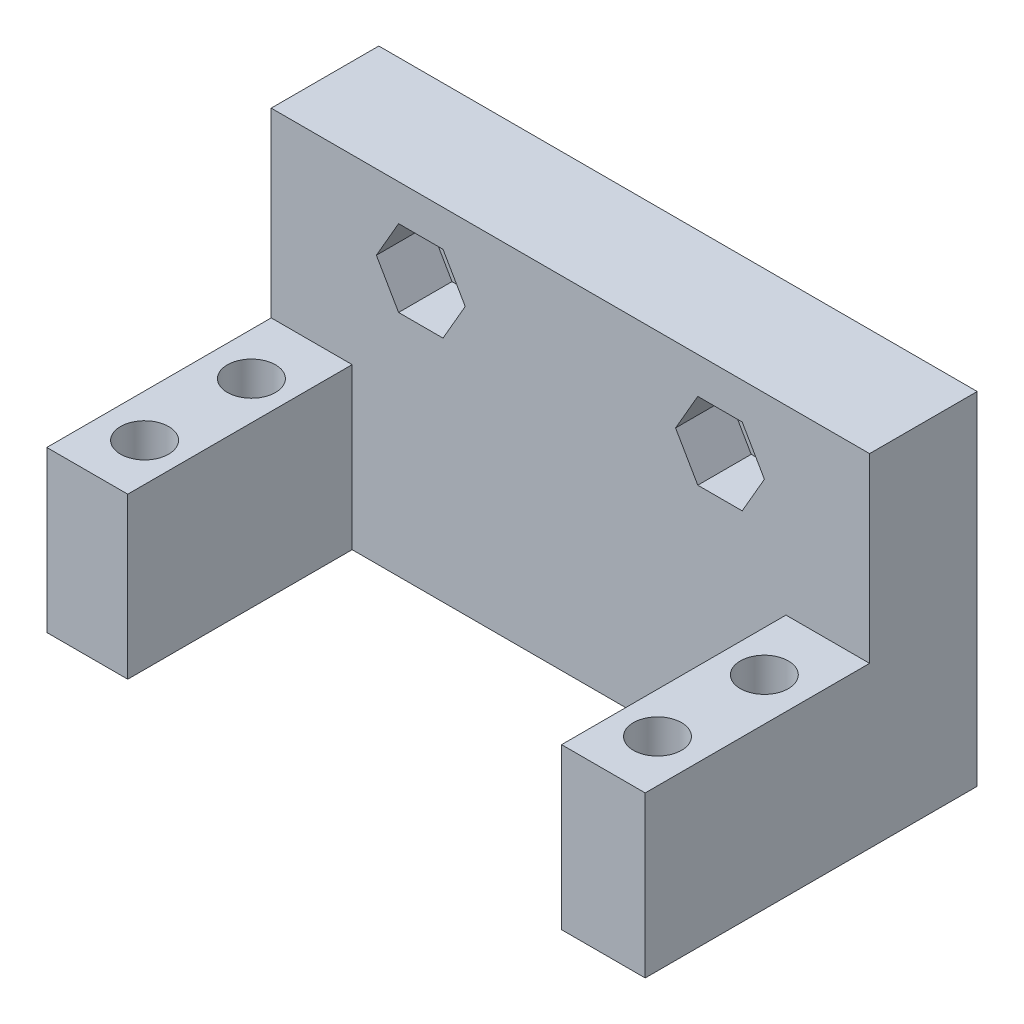
ISO-10303-21;
HEADER;
FILE_DESCRIPTION(('STEP AP214'),'2;1');
FILE_NAME('part.step','',(''),(''),'','','');
FILE_SCHEMA(('AUTOMOTIVE_DESIGN { 1 0 10303 214 1 1 1 1 }'));
ENDSEC;
DATA;
#1=APPLICATION_CONTEXT('core data for automotive mechanical design processes');
#2=APPLICATION_PROTOCOL_DEFINITION('international standard','automotive_design',2000,#1);
#3=PRODUCT_CONTEXT('',#1,'mechanical');
#4=PRODUCT('Part','Part','',(#3));
#5=PRODUCT_RELATED_PRODUCT_CATEGORY('part','',(#4));
#6=PRODUCT_DEFINITION_FORMATION('','',#4);
#7=PRODUCT_DEFINITION_CONTEXT('part definition',#1,'design');
#8=PRODUCT_DEFINITION('design','',#6,#7);
#9=PRODUCT_DEFINITION_SHAPE('','',#8);
#10=(LENGTH_UNIT() NAMED_UNIT(*) SI_UNIT(.MILLI.,.METRE.));
#11=(NAMED_UNIT(*) PLANE_ANGLE_UNIT() SI_UNIT($,.RADIAN.));
#12=(NAMED_UNIT(*) SI_UNIT($,.STERADIAN.) SOLID_ANGLE_UNIT());
#13=UNCERTAINTY_MEASURE_WITH_UNIT(LENGTH_MEASURE(1.E-05),#10,'distance_accuracy_value','');
#14=(GEOMETRIC_REPRESENTATION_CONTEXT(3) GLOBAL_UNCERTAINTY_ASSIGNED_CONTEXT((#13)) GLOBAL_UNIT_ASSIGNED_CONTEXT((#10,
#11,#12)) REPRESENTATION_CONTEXT('',''));
#15=CARTESIAN_POINT('',(0.,0.,0.));
#16=DIRECTION('',(0.,0.,1.));
#17=DIRECTION('',(1.,0.,0.));
#18=AXIS2_PLACEMENT_3D('',#15,#16,#17);
#19=CARTESIAN_POINT('',(0.,-14.,10.07));
#20=DIRECTION('',(0.,0.,1.));
#21=DIRECTION('',(1.,0.,0.));
#22=AXIS2_PLACEMENT_3D('',#19,#20,#21);
#23=PLANE('',#22);
#24=DIRECTION('',(-0.500000000000005,0.866025403784436,0.));
#25=VECTOR('',#24,1.);
#26=CARTESIAN_POINT('',(-7.38230854637598,-4.2621778264911,10.07));
#27=LINE('',#26,#25);
#28=CARTESIAN_POINT('',(-9.84307806183471,0.,10.07));
#29=VERTEX_POINT('',#28);
#30=CARTESIAN_POINT('',(-11.9215390309174,3.6,10.07));
#31=VERTEX_POINT('',#30);
#32=EDGE_CURVE('E284',#29,#31,#27,.T.);
#33=ORIENTED_EDGE('',*,*,#32,.F.);
#34=DIRECTION('',(0.499999999999996,0.866025403784441,0.));
#35=VECTOR('',#34,1.);
#36=CARTESIAN_POINT('',(-7.38230854637608,4.26217782649105,10.07));
#37=LINE('',#36,#35);
#38=CARTESIAN_POINT('',(-11.9215390309173,-3.59999999999998,10.07));
#39=VERTEX_POINT('',#38);
#40=EDGE_CURVE('E268',#39,#29,#37,.T.);
#41=ORIENTED_EDGE('',*,*,#40,.F.);
#42=DIRECTION('',(1.,0.,0.));
#43=VECTOR('',#42,1.);
#44=CARTESIAN_POINT('',(0.,-3.59999999999992,10.07));
#45=LINE('',#44,#43);
#46=CARTESIAN_POINT('',(-16.0784609690826,-3.60000000000001,10.07));
#47=VERTEX_POINT('',#46);
#48=EDGE_CURVE('E296',#47,#39,#45,.T.);
#49=ORIENTED_EDGE('',*,*,#48,.F.);
#50=DIRECTION('',(0.500000000000005,-0.866025403784436,0.));
#51=VECTOR('',#50,1.);
#52=CARTESIAN_POINT('',(-13.6176914536239,-7.86217782649112,10.07));
#53=LINE('',#52,#51);
#54=CARTESIAN_POINT('',(-18.1569219381653,0.,10.07));
#55=VERTEX_POINT('',#54);
#56=EDGE_CURVE('E293',#55,#47,#53,.T.);
#57=ORIENTED_EDGE('',*,*,#56,.F.);
#58=DIRECTION('',(-0.5,-0.866025403784439,0.));
#59=VECTOR('',#58,1.);
#60=CARTESIAN_POINT('',(-13.617691453624,7.86217782649107,10.07));
#61=LINE('',#60,#59);
#62=CARTESIAN_POINT('',(-16.0784609690827,3.6,10.07));
#63=VERTEX_POINT('',#62);
#64=EDGE_CURVE('E290',#63,#55,#61,.T.);
#65=ORIENTED_EDGE('',*,*,#64,.F.);
#66=DIRECTION('',(-1.,0.,0.));
#67=VECTOR('',#66,1.);
#68=CARTESIAN_POINT('',(0.,3.6,10.07));
#69=LINE('',#68,#67);
#70=EDGE_CURVE('E286',#31,#63,#69,.T.);
#71=ORIENTED_EDGE('',*,*,#70,.F.);
#72=EDGE_LOOP('',(#33,#41,#49,#57,#65,#71));
#73=FACE_BOUND('',#72,.T.);
#74=DIRECTION('',(-0.500000000000004,0.866025403784436,0.));
#75=VECTOR('',#74,1.);
#76=CARTESIAN_POINT('',(13.6176914536239,7.86217782649111,10.07));
#77=LINE('',#76,#75);
#78=CARTESIAN_POINT('',(18.1569219381653,0.,10.07));
#79=VERTEX_POINT('',#78);
#80=CARTESIAN_POINT('',(16.0784609690826,3.59999999999999,10.07));
#81=VERTEX_POINT('',#80);
#82=EDGE_CURVE('E263',#79,#81,#77,.T.);
#83=ORIENTED_EDGE('',*,*,#82,.F.);
#84=DIRECTION('',(0.499999999999995,0.866025403784441,0.));
#85=VECTOR('',#84,1.);
#86=CARTESIAN_POINT('',(13.617691453624,-7.862177826491,10.07));
#87=LINE('',#86,#85);
#88=CARTESIAN_POINT('',(16.0784609690827,-3.59999999999998,10.07));
#89=VERTEX_POINT('',#88);
#90=EDGE_CURVE('E318',#89,#79,#87,.T.);
#91=ORIENTED_EDGE('',*,*,#90,.F.);
#92=DIRECTION('',(1.,0.,0.));
#93=VECTOR('',#92,1.);
#94=CARTESIAN_POINT('',(0.,-3.60000000000005,10.07));
#95=LINE('',#94,#93);
#96=CARTESIAN_POINT('',(11.9215390309174,-3.6,10.07));
#97=VERTEX_POINT('',#96);
#98=EDGE_CURVE('E344',#97,#89,#95,.T.);
#99=ORIENTED_EDGE('',*,*,#98,.F.);
#100=DIRECTION('',(0.500000000000004,-0.866025403784436,0.));
#101=VECTOR('',#100,1.);
#102=CARTESIAN_POINT('',(7.38230854637599,4.2621778264911,10.07));
#103=LINE('',#102,#101);
#104=CARTESIAN_POINT('',(9.84307806183472,0.,10.07));
#105=VERTEX_POINT('',#104);
#106=EDGE_CURVE('E341',#105,#97,#103,.T.);
#107=ORIENTED_EDGE('',*,*,#106,.F.);
#108=DIRECTION('',(-0.499999999999996,-0.866025403784441,0.));
#109=VECTOR('',#108,1.);
#110=CARTESIAN_POINT('',(7.38230854637609,-4.26217782649106,10.07));
#111=LINE('',#110,#109);
#112=CARTESIAN_POINT('',(11.9215390309173,3.59999999999997,10.07));
#113=VERTEX_POINT('',#112);
#114=EDGE_CURVE('E338',#113,#105,#111,.T.);
#115=ORIENTED_EDGE('',*,*,#114,.F.);
#116=DIRECTION('',(-1.,0.,0.));
#117=VECTOR('',#116,1.);
#118=CARTESIAN_POINT('',(0.,3.59999999999993,10.07));
#119=LINE('',#118,#117);
#120=EDGE_CURVE('E335',#81,#113,#119,.T.);
#121=ORIENTED_EDGE('',*,*,#120,.F.);
#122=EDGE_LOOP('',(#83,#91,#99,#107,#115,#121));
#123=FACE_BOUND('',#122,.T.);
#124=DIRECTION('',(0.,-1.,0.));
#125=VECTOR('',#124,1.);
#126=CARTESIAN_POINT('',(20.1750886473847,-9.99999999999999,10.07));
#127=LINE('',#126,#125);
#128=CARTESIAN_POINT('',(20.1750886473847,-9.99999999999999,10.07));
#129=VERTEX_POINT('',#128);
#130=CARTESIAN_POINT('',(20.1750886473847,-25.,10.07));
#131=VERTEX_POINT('',#130);
#132=EDGE_CURVE('E214',#129,#131,#127,.T.);
#133=ORIENTED_EDGE('',*,*,#132,.F.);
#134=DIRECTION('',(-1.,0.,0.));
#135=VECTOR('',#134,1.);
#136=CARTESIAN_POINT('',(28.,-10.,10.07));
#137=LINE('',#136,#135);
#138=CARTESIAN_POINT('',(28.,-10.,10.07));
#139=VERTEX_POINT('',#138);
#140=EDGE_CURVE('E211',#139,#129,#137,.T.);
#141=ORIENTED_EDGE('',*,*,#140,.F.);
#142=DIRECTION('',(0.,1.,0.));
#143=VECTOR('',#142,1.);
#144=CARTESIAN_POINT('',(28.,-10.,10.07));
#145=LINE('',#144,#143);
#146=CARTESIAN_POINT('',(28.,7.,10.07));
#147=VERTEX_POINT('',#146);
#148=EDGE_CURVE('E238',#139,#147,#145,.T.);
#149=ORIENTED_EDGE('',*,*,#148,.T.);
#150=DIRECTION('',(1.,0.,0.));
#151=VECTOR('',#150,1.);
#152=CARTESIAN_POINT('',(0.,7.,10.07));
#153=LINE('',#152,#151);
#154=CARTESIAN_POINT('',(-28.,7.,10.07));
#155=VERTEX_POINT('',#154);
#156=EDGE_CURVE('E386',#155,#147,#153,.T.);
#157=ORIENTED_EDGE('',*,*,#156,.F.);
#158=DIRECTION('',(0.,1.,0.));
#159=VECTOR('',#158,1.);
#160=CARTESIAN_POINT('',(-28.,-10.,10.07));
#161=LINE('',#160,#159);
#162=CARTESIAN_POINT('',(-28.,-10.,10.07));
#163=VERTEX_POINT('',#162);
#164=EDGE_CURVE('E239',#163,#155,#161,.T.);
#165=ORIENTED_EDGE('',*,*,#164,.F.);
#166=CARTESIAN_POINT('',(-20.4249113526153,-10.,10.07));
#167=VERTEX_POINT('',#166);
#168=EDGE_CURVE('E58',#167,#163,#137,.T.);
#169=ORIENTED_EDGE('',*,*,#168,.F.);
#170=DIRECTION('',(0.,1.,0.));
#171=VECTOR('',#170,1.);
#172=CARTESIAN_POINT('',(-20.4249113526153,-25.,10.07));
#173=LINE('',#172,#171);
#174=CARTESIAN_POINT('',(-20.4249113526153,-25.,10.07));
#175=VERTEX_POINT('',#174);
#176=EDGE_CURVE('E229',#175,#167,#173,.T.);
#177=ORIENTED_EDGE('',*,*,#176,.F.);
#178=DIRECTION('',(-1.,0.,0.));
#179=VECTOR('',#178,1.);
#180=CARTESIAN_POINT('',(0.,-25.,10.07));
#181=LINE('',#180,#179);
#182=EDGE_CURVE('E66',#131,#175,#181,.T.);
#183=ORIENTED_EDGE('',*,*,#182,.F.);
#184=EDGE_LOOP('',(#133,#141,#149,#157,#165,#169,#177,#183));
#185=FACE_BOUND('',#184,.T.);
#186=ADVANCED_FACE('F41',(#73,#123,#185),#23,.T.);
#187=CARTESIAN_POINT('',(0.,0.,31.07));
#188=DIRECTION('',(0.,0.,1.));
#189=DIRECTION('',(1.,0.,0.));
#190=AXIS2_PLACEMENT_3D('',#187,#188,#189);
#191=PLANE('',#190);
#192=DIRECTION('',(-1.,0.,0.));
#193=VECTOR('',#192,1.);
#194=CARTESIAN_POINT('',(0.,-25.,31.07));
#195=LINE('',#194,#193);
#196=CARTESIAN_POINT('',(-20.4249113526153,-25.,31.07));
#197=VERTEX_POINT('',#196);
#198=CARTESIAN_POINT('',(-28.,-25.,31.07));
#199=VERTEX_POINT('',#198);
#200=EDGE_CURVE('E366',#197,#199,#195,.T.);
#201=ORIENTED_EDGE('',*,*,#200,.F.);
#202=DIRECTION('',(0.,-1.,0.));
#203=VECTOR('',#202,1.);
#204=CARTESIAN_POINT('',(-20.4249113526153,-25.,31.07));
#205=LINE('',#204,#203);
#206=CARTESIAN_POINT('',(-20.4249113526153,-10.,31.07));
#207=VERTEX_POINT('',#206);
#208=EDGE_CURVE('E223',#207,#197,#205,.T.);
#209=ORIENTED_EDGE('',*,*,#208,.F.);
#210=DIRECTION('',(1.,0.,0.));
#211=VECTOR('',#210,1.);
#212=CARTESIAN_POINT('',(28.,-10.,31.07));
#213=LINE('',#212,#211);
#214=CARTESIAN_POINT('',(-28.,-10.,31.07));
#215=VERTEX_POINT('',#214);
#216=EDGE_CURVE('E204',#215,#207,#213,.T.);
#217=ORIENTED_EDGE('',*,*,#216,.F.);
#218=DIRECTION('',(0.,-1.,0.));
#219=VECTOR('',#218,1.);
#220=CARTESIAN_POINT('',(-28.,-7.,31.07));
#221=LINE('',#220,#219);
#222=EDGE_CURVE('E392',#215,#199,#221,.T.);
#223=ORIENTED_EDGE('',*,*,#222,.T.);
#224=EDGE_LOOP('',(#201,#209,#217,#223));
#225=FACE_BOUND('',#224,.T.);
#226=ADVANCED_FACE('F436',(#225),#191,.T.);
#227=DIRECTION('',(0.,1.,0.));
#228=VECTOR('',#227,1.);
#229=CARTESIAN_POINT('',(28.,-7.,31.07));
#230=LINE('',#229,#228);
#231=CARTESIAN_POINT('',(28.,-25.,31.07));
#232=VERTEX_POINT('',#231);
#233=CARTESIAN_POINT('',(28.,-10.,31.07));
#234=VERTEX_POINT('',#233);
#235=EDGE_CURVE('E200',#232,#234,#230,.T.);
#236=ORIENTED_EDGE('',*,*,#235,.T.);
#237=CARTESIAN_POINT('',(20.1750886473847,-9.99999999999999,31.07));
#238=VERTEX_POINT('',#237);
#239=EDGE_CURVE('E194',#238,#234,#213,.T.);
#240=ORIENTED_EDGE('',*,*,#239,.F.);
#241=DIRECTION('',(0.,1.,0.));
#242=VECTOR('',#241,1.);
#243=CARTESIAN_POINT('',(20.1750886473847,-9.99999999999999,31.07));
#244=LINE('',#243,#242);
#245=CARTESIAN_POINT('',(20.1750886473847,-25.,31.07));
#246=VERTEX_POINT('',#245);
#247=EDGE_CURVE('E199',#246,#238,#244,.T.);
#248=ORIENTED_EDGE('',*,*,#247,.F.);
#249=DIRECTION('',(-1.,0.,0.));
#250=VECTOR('',#249,1.);
#251=CARTESIAN_POINT('',(0.,-25.,31.07));
#252=LINE('',#251,#250);
#253=EDGE_CURVE('E378',#232,#246,#252,.T.);
#254=ORIENTED_EDGE('',*,*,#253,.F.);
#255=EDGE_LOOP('',(#236,#240,#248,#254));
#256=FACE_BOUND('',#255,.T.);
#257=ADVANCED_FACE('F196',(#256),#191,.T.);
#258=CARTESIAN_POINT('',(24.0000000000001,-13.3639610306789,25.92));
#259=DIRECTION('',(0.,1.,0.));
#260=DIRECTION('',(-1.,0.,0.));
#261=AXIS2_PLACEMENT_3D('',#258,#259,#260);
#262=CYLINDRICAL_SURFACE('',#261,2.25);
#263=CARTESIAN_POINT('',(24.0000000000001,-25.,25.92));
#264=DIRECTION('',(0.,-1.,0.));
#265=DIRECTION('',(1.,0.,0.));
#266=AXIS2_PLACEMENT_3D('',#263,#264,#265);
#267=CIRCLE('',#266,2.25);
#268=CARTESIAN_POINT('',(26.2500000000001,-25.,25.92));
#269=VERTEX_POINT('',#268);
#270=EDGE_CURVE('E362',#269,#269,#267,.F.);
#271=ORIENTED_EDGE('',*,*,#270,.F.);
#272=EDGE_LOOP('',(#271));
#273=FACE_BOUND('',#272,.T.);
#274=CARTESIAN_POINT('',(24.0000000000001,-10.,25.92));
#275=DIRECTION('',(0.,1.,0.));
#276=DIRECTION('',(-1.,0.,0.));
#277=AXIS2_PLACEMENT_3D('',#274,#275,#276);
#278=CIRCLE('',#277,2.25);
#279=CARTESIAN_POINT('',(21.7500000000001,-10.,25.92));
#280=VERTEX_POINT('',#279);
#281=EDGE_CURVE('E253',#280,#280,#278,.F.);
#282=ORIENTED_EDGE('',*,*,#281,.F.);
#283=EDGE_LOOP('',(#282));
#284=FACE_BOUND('',#283,.T.);
#285=ADVANCED_FACE('F530',(#273,#284),#262,.F.);
#286=CARTESIAN_POINT('',(-24.,-13.3639610306789,15.92));
#287=DIRECTION('',(0.,1.,0.));
#288=DIRECTION('',(-1.,0.,0.));
#289=AXIS2_PLACEMENT_3D('',#286,#287,#288);
#290=CYLINDRICAL_SURFACE('',#289,2.25);
#291=CARTESIAN_POINT('',(-24.,-25.,15.92));
#292=DIRECTION('',(0.,-1.,0.));
#293=DIRECTION('',(1.,0.,0.));
#294=AXIS2_PLACEMENT_3D('',#291,#292,#293);
#295=CIRCLE('',#294,2.25);
#296=CARTESIAN_POINT('',(-21.75,-25.,15.92));
#297=VERTEX_POINT('',#296);
#298=EDGE_CURVE('E380',#297,#297,#295,.F.);
#299=ORIENTED_EDGE('',*,*,#298,.F.);
#300=EDGE_LOOP('',(#299));
#301=FACE_BOUND('',#300,.T.);
#302=CARTESIAN_POINT('',(-24.,-10.,15.92));
#303=DIRECTION('',(0.,1.,0.));
#304=DIRECTION('',(-1.,0.,0.));
#305=AXIS2_PLACEMENT_3D('',#302,#303,#304);
#306=CIRCLE('',#305,2.25);
#307=CARTESIAN_POINT('',(-26.25,-10.,15.92));
#308=VERTEX_POINT('',#307);
#309=EDGE_CURVE('E250',#308,#308,#306,.F.);
#310=ORIENTED_EDGE('',*,*,#309,.F.);
#311=EDGE_LOOP('',(#310));
#312=FACE_BOUND('',#311,.T.);
#313=ADVANCED_FACE('F526',(#301,#312),#290,.F.);
#314=CARTESIAN_POINT('',(-23.9999999999999,-13.3639610306789,25.92));
#315=DIRECTION('',(0.,1.,0.));
#316=DIRECTION('',(-1.,0.,0.));
#317=AXIS2_PLACEMENT_3D('',#314,#315,#316);
#318=CYLINDRICAL_SURFACE('',#317,2.25);
#319=CARTESIAN_POINT('',(-23.9999999999999,-25.,25.92));
#320=DIRECTION('',(0.,-1.,0.));
#321=DIRECTION('',(1.,0.,0.));
#322=AXIS2_PLACEMENT_3D('',#319,#320,#321);
#323=CIRCLE('',#322,2.25);
#324=CARTESIAN_POINT('',(-21.7499999999999,-25.,25.92));
#325=VERTEX_POINT('',#324);
#326=EDGE_CURVE('E303',#325,#325,#323,.F.);
#327=ORIENTED_EDGE('',*,*,#326,.F.);
#328=EDGE_LOOP('',(#327));
#329=FACE_BOUND('',#328,.T.);
#330=CARTESIAN_POINT('',(-23.9999999999999,-10.,25.92));
#331=DIRECTION('',(0.,1.,0.));
#332=DIRECTION('',(-1.,0.,0.));
#333=AXIS2_PLACEMENT_3D('',#330,#331,#332);
#334=CIRCLE('',#333,2.25);
#335=CARTESIAN_POINT('',(-26.2499999999999,-10.,25.92));
#336=VERTEX_POINT('',#335);
#337=EDGE_CURVE('E247',#336,#336,#334,.F.);
#338=ORIENTED_EDGE('',*,*,#337,.F.);
#339=EDGE_LOOP('',(#338));
#340=FACE_BOUND('',#339,.T.);
#341=ADVANCED_FACE('F529',(#329,#340),#318,.F.);
#342=CARTESIAN_POINT('',(24.,-13.3639610306789,15.92));
#343=DIRECTION('',(0.,1.,0.));
#344=DIRECTION('',(-1.,0.,0.));
#345=AXIS2_PLACEMENT_3D('',#342,#343,#344);
#346=CYLINDRICAL_SURFACE('',#345,2.25);
#347=CARTESIAN_POINT('',(24.,-25.,15.92));
#348=DIRECTION('',(0.,-1.,0.));
#349=DIRECTION('',(1.,0.,0.));
#350=AXIS2_PLACEMENT_3D('',#347,#348,#349);
#351=CIRCLE('',#350,2.25);
#352=CARTESIAN_POINT('',(26.25,-25.,15.92));
#353=VERTEX_POINT('',#352);
#354=EDGE_CURVE('E383',#353,#353,#351,.F.);
#355=ORIENTED_EDGE('',*,*,#354,.F.);
#356=EDGE_LOOP('',(#355));
#357=FACE_BOUND('',#356,.T.);
#358=CARTESIAN_POINT('',(24.,-10.,15.92));
#359=DIRECTION('',(0.,1.,0.));
#360=DIRECTION('',(-1.,0.,0.));
#361=AXIS2_PLACEMENT_3D('',#358,#359,#360);
#362=CIRCLE('',#361,2.25);
#363=CARTESIAN_POINT('',(21.75,-10.,15.92));
#364=VERTEX_POINT('',#363);
#365=EDGE_CURVE('E242',#364,#364,#362,.F.);
#366=ORIENTED_EDGE('',*,*,#365,.F.);
#367=EDGE_LOOP('',(#366));
#368=FACE_BOUND('',#367,.T.);
#369=ADVANCED_FACE('F532',(#357,#368),#346,.F.);
#370=CARTESIAN_POINT('',(0.,7.,10.77));
#371=DIRECTION('',(0.,-1.,0.));
#372=DIRECTION('',(1.,0.,0.));
#373=AXIS2_PLACEMENT_3D('',#370,#371,#372);
#374=PLANE('',#373);
#375=DIRECTION('',(0.,0.,-1.));
#376=VECTOR('',#375,1.);
#377=CARTESIAN_POINT('',(-28.,7.,31.07));
#378=LINE('',#377,#376);
#379=CARTESIAN_POINT('',(-28.,7.,0.));
#380=VERTEX_POINT('',#379);
#381=EDGE_CURVE('E397',#155,#380,#378,.T.);
#382=ORIENTED_EDGE('',*,*,#381,.F.);
#383=ORIENTED_EDGE('',*,*,#156,.T.);
#384=DIRECTION('',(0.,0.,-1.));
#385=VECTOR('',#384,1.);
#386=CARTESIAN_POINT('',(28.,7.,31.07));
#387=LINE('',#386,#385);
#388=CARTESIAN_POINT('',(28.,7.,0.));
#389=VERTEX_POINT('',#388);
#390=EDGE_CURVE('E50',#147,#389,#387,.T.);
#391=ORIENTED_EDGE('',*,*,#390,.T.);
#392=DIRECTION('',(-1.,0.,0.));
#393=VECTOR('',#392,1.);
#394=CARTESIAN_POINT('',(0.,7.,0.));
#395=LINE('',#394,#393);
#396=EDGE_CURVE('E11',#389,#380,#395,.T.);
#397=ORIENTED_EDGE('',*,*,#396,.T.);
#398=EDGE_LOOP('',(#382,#383,#391,#397));
#399=FACE_BOUND('',#398,.T.);
#400=ADVANCED_FACE('F43',(#399),#374,.F.);
#401=CARTESIAN_POINT('',(0.,0.,0.));
#402=DIRECTION('',(0.,0.,1.));
#403=DIRECTION('',(1.,0.,0.));
#404=AXIS2_PLACEMENT_3D('',#401,#402,#403);
#405=PLANE('',#404);
#406=CARTESIAN_POINT('',(14.,0.,0.));
#407=DIRECTION('',(0.,0.,1.));
#408=DIRECTION('',(1.,0.,0.));
#409=AXIS2_PLACEMENT_3D('',#406,#407,#408);
#410=CIRCLE('',#409,2.2);
#411=CARTESIAN_POINT('',(16.2,0.,0.));
#412=VERTEX_POINT('',#411);
#413=EDGE_CURVE('E260',#412,#412,#410,.T.);
#414=ORIENTED_EDGE('',*,*,#413,.T.);
#415=EDGE_LOOP('',(#414));
#416=FACE_BOUND('',#415,.T.);
#417=CARTESIAN_POINT('',(-14.,0.,0.));
#418=DIRECTION('',(0.,0.,1.));
#419=DIRECTION('',(1.,0.,0.));
#420=AXIS2_PLACEMENT_3D('',#417,#418,#419);
#421=CIRCLE('',#420,2.2);
#422=CARTESIAN_POINT('',(-11.8,0.,0.));
#423=VERTEX_POINT('',#422);
#424=EDGE_CURVE('E257',#423,#423,#421,.T.);
#425=ORIENTED_EDGE('',*,*,#424,.T.);
#426=EDGE_LOOP('',(#425));
#427=FACE_BOUND('',#426,.T.);
#428=DIRECTION('',(0.,1.,0.));
#429=VECTOR('',#428,1.);
#430=CARTESIAN_POINT('',(28.,-64.0262474655312,0.));
#431=LINE('',#430,#429);
#432=CARTESIAN_POINT('',(28.,-25.,0.));
#433=VERTEX_POINT('',#432);
#434=EDGE_CURVE('E388',#433,#389,#431,.T.);
#435=ORIENTED_EDGE('',*,*,#434,.F.);
#436=DIRECTION('',(1.,0.,0.));
#437=VECTOR('',#436,1.);
#438=CARTESIAN_POINT('',(0.,-25.,0.));
#439=LINE('',#438,#437);
#440=CARTESIAN_POINT('',(-28.,-25.,0.));
#441=VERTEX_POINT('',#440);
#442=EDGE_CURVE('E372',#441,#433,#439,.T.);
#443=ORIENTED_EDGE('',*,*,#442,.F.);
#444=DIRECTION('',(0.,1.,0.));
#445=VECTOR('',#444,1.);
#446=CARTESIAN_POINT('',(-28.,-64.0262474655312,0.));
#447=LINE('',#446,#445);
#448=EDGE_CURVE('E389',#441,#380,#447,.T.);
#449=ORIENTED_EDGE('',*,*,#448,.T.);
#450=ORIENTED_EDGE('',*,*,#396,.F.);
#451=EDGE_LOOP('',(#435,#443,#449,#450));
#452=FACE_BOUND('',#451,.T.);
#453=ADVANCED_FACE('F457',(#416,#427,#452),#405,.F.);
#454=CARTESIAN_POINT('',(28.,-7.,31.07));
#455=DIRECTION('',(-1.,0.,0.));
#456=DIRECTION('',(0.,0.,1.));
#457=AXIS2_PLACEMENT_3D('',#454,#455,#456);
#458=PLANE('',#457);
#459=ORIENTED_EDGE('',*,*,#390,.F.);
#460=ORIENTED_EDGE('',*,*,#148,.F.);
#461=DIRECTION('',(0.,0.,-1.));
#462=VECTOR('',#461,1.);
#463=CARTESIAN_POINT('',(28.,-10.,31.07));
#464=LINE('',#463,#462);
#465=EDGE_CURVE('E234',#234,#139,#464,.T.);
#466=ORIENTED_EDGE('',*,*,#465,.F.);
#467=ORIENTED_EDGE('',*,*,#235,.F.);
#468=DIRECTION('',(0.,0.,1.));
#469=VECTOR('',#468,1.);
#470=CARTESIAN_POINT('',(28.,-25.,0.));
#471=LINE('',#470,#469);
#472=EDGE_CURVE('E375',#433,#232,#471,.T.);
#473=ORIENTED_EDGE('',*,*,#472,.F.);
#474=ORIENTED_EDGE('',*,*,#434,.T.);
#475=EDGE_LOOP('',(#459,#460,#466,#467,#473,#474));
#476=FACE_BOUND('',#475,.T.);
#477=ADVANCED_FACE('F447',(#476),#458,.F.);
#478=CARTESIAN_POINT('',(-28.,-7.,31.07));
#479=DIRECTION('',(1.,0.,0.));
#480=DIRECTION('',(0.,0.,-1.));
#481=AXIS2_PLACEMENT_3D('',#478,#479,#480);
#482=PLANE('',#481);
#483=DIRECTION('',(0.,0.,1.));
#484=VECTOR('',#483,1.);
#485=CARTESIAN_POINT('',(-28.,-10.,31.07));
#486=LINE('',#485,#484);
#487=EDGE_CURVE('E205',#163,#215,#486,.T.);
#488=ORIENTED_EDGE('',*,*,#487,.F.);
#489=ORIENTED_EDGE('',*,*,#164,.T.);
#490=ORIENTED_EDGE('',*,*,#381,.T.);
#491=ORIENTED_EDGE('',*,*,#448,.F.);
#492=DIRECTION('',(0.,0.,-1.));
#493=VECTOR('',#492,1.);
#494=CARTESIAN_POINT('',(-28.,-25.,0.));
#495=LINE('',#494,#493);
#496=EDGE_CURVE('E369',#199,#441,#495,.T.);
#497=ORIENTED_EDGE('',*,*,#496,.F.);
#498=ORIENTED_EDGE('',*,*,#222,.F.);
#499=EDGE_LOOP('',(#488,#489,#490,#491,#497,#498));
#500=FACE_BOUND('',#499,.T.);
#501=ADVANCED_FACE('F453',(#500),#482,.F.);
#502=CARTESIAN_POINT('',(0.,-25.,0.));
#503=DIRECTION('',(0.,-1.,0.));
#504=DIRECTION('',(1.,0.,0.));
#505=AXIS2_PLACEMENT_3D('',#502,#503,#504);
#506=PLANE('',#505);
#507=DIRECTION('',(0.,0.,1.));
#508=VECTOR('',#507,1.);
#509=CARTESIAN_POINT('',(20.1750886473847,-25.,31.07));
#510=LINE('',#509,#508);
#511=EDGE_CURVE('E218',#131,#246,#510,.T.);
#512=ORIENTED_EDGE('',*,*,#511,.F.);
#513=ORIENTED_EDGE('',*,*,#182,.T.);
#514=DIRECTION('',(0.,0.,-1.));
#515=VECTOR('',#514,1.);
#516=CARTESIAN_POINT('',(-20.4249113526153,-25.,31.07));
#517=LINE('',#516,#515);
#518=EDGE_CURVE('E226',#197,#175,#517,.T.);
#519=ORIENTED_EDGE('',*,*,#518,.F.);
#520=ORIENTED_EDGE('',*,*,#200,.T.);
#521=ORIENTED_EDGE('',*,*,#496,.T.);
#522=ORIENTED_EDGE('',*,*,#442,.T.);
#523=ORIENTED_EDGE('',*,*,#472,.T.);
#524=ORIENTED_EDGE('',*,*,#253,.T.);
#525=EDGE_LOOP('',(#512,#513,#519,#520,#521,#522,#523,#524));
#526=FACE_BOUND('',#525,.T.);
#527=ORIENTED_EDGE('',*,*,#326,.T.);
#528=EDGE_LOOP('',(#527));
#529=FACE_BOUND('',#528,.T.);
#530=ORIENTED_EDGE('',*,*,#270,.T.);
#531=EDGE_LOOP('',(#530));
#532=FACE_BOUND('',#531,.T.);
#533=ORIENTED_EDGE('',*,*,#298,.T.);
#534=EDGE_LOOP('',(#533));
#535=FACE_BOUND('',#534,.T.);
#536=ORIENTED_EDGE('',*,*,#354,.T.);
#537=EDGE_LOOP('',(#536));
#538=FACE_BOUND('',#537,.T.);
#539=ADVANCED_FACE('F441',(#526,#529,#532,#535,#538),#506,.T.);
#540=CARTESIAN_POINT('',(13.6176914536239,7.86217782649111,5.07));
#541=DIRECTION('',(0.866025403784436,0.500000000000004,0.));
#542=DIRECTION('',(-0.500000000000004,0.866025403784436,0.));
#543=AXIS2_PLACEMENT_3D('',#540,#541,#542);
#544=PLANE('',#543);
#545=ORIENTED_EDGE('',*,*,#82,.T.);
#546=DIRECTION('',(0.,0.,1.));
#547=VECTOR('',#546,1.);
#548=CARTESIAN_POINT('',(16.0784609690826,3.59999999999999,5.07));
#549=LINE('',#548,#547);
#550=CARTESIAN_POINT('',(16.0784609690826,3.59999999999999,5.07));
#551=VERTEX_POINT('',#550);
#552=EDGE_CURVE('E333',#551,#81,#549,.T.);
#553=ORIENTED_EDGE('',*,*,#552,.F.);
#554=DIRECTION('',(-0.500000000000004,0.866025403784436,0.));
#555=VECTOR('',#554,1.);
#556=CARTESIAN_POINT('',(13.6176914536239,7.86217782649111,5.07));
#557=LINE('',#556,#555);
#558=CARTESIAN_POINT('',(18.1569219381653,0.,5.07));
#559=VERTEX_POINT('',#558);
#560=EDGE_CURVE('E314',#559,#551,#557,.T.);
#561=ORIENTED_EDGE('',*,*,#560,.F.);
#562=DIRECTION('',(0.,0.,1.));
#563=VECTOR('',#562,1.);
#564=CARTESIAN_POINT('',(18.1569219381653,0.,5.07));
#565=LINE('',#564,#563);
#566=EDGE_CURVE('E287',#559,#79,#565,.T.);
#567=ORIENTED_EDGE('',*,*,#566,.T.);
#568=EDGE_LOOP('',(#545,#553,#561,#567));
#569=FACE_BOUND('',#568,.T.);
#570=ADVANCED_FACE('F505',(#569),#544,.F.);
#571=CARTESIAN_POINT('',(13.617691453624,-7.862177826491,5.07));
#572=DIRECTION('',(0.866025403784441,-0.499999999999995,0.));
#573=DIRECTION('',(0.499999999999995,0.866025403784441,0.));
#574=AXIS2_PLACEMENT_3D('',#571,#572,#573);
#575=PLANE('',#574);
#576=ORIENTED_EDGE('',*,*,#90,.T.);
#577=ORIENTED_EDGE('',*,*,#566,.F.);
#578=DIRECTION('',(0.499999999999995,0.866025403784441,0.));
#579=VECTOR('',#578,1.);
#580=CARTESIAN_POINT('',(13.617691453624,-7.862177826491,5.07));
#581=LINE('',#580,#579);
#582=CARTESIAN_POINT('',(16.0784609690827,-3.59999999999998,5.07));
#583=VERTEX_POINT('',#582);
#584=EDGE_CURVE('E330',#583,#559,#581,.T.);
#585=ORIENTED_EDGE('',*,*,#584,.F.);
#586=DIRECTION('',(0.,0.,1.));
#587=VECTOR('',#586,1.);
#588=CARTESIAN_POINT('',(16.0784609690827,-3.59999999999998,5.07));
#589=LINE('',#588,#587);
#590=EDGE_CURVE('E350',#583,#89,#589,.T.);
#591=ORIENTED_EDGE('',*,*,#590,.T.);
#592=EDGE_LOOP('',(#576,#577,#585,#591));
#593=FACE_BOUND('',#592,.T.);
#594=ADVANCED_FACE('F501',(#593),#575,.F.);
#595=CARTESIAN_POINT('',(0.,-3.60000000000005,5.07));
#596=DIRECTION('',(0.,-1.,0.));
#597=DIRECTION('',(1.,0.,0.));
#598=AXIS2_PLACEMENT_3D('',#595,#596,#597);
#599=PLANE('',#598);
#600=ORIENTED_EDGE('',*,*,#98,.T.);
#601=ORIENTED_EDGE('',*,*,#590,.F.);
#602=DIRECTION('',(1.,0.,0.));
#603=VECTOR('',#602,1.);
#604=CARTESIAN_POINT('',(0.,-3.60000000000005,5.07));
#605=LINE('',#604,#603);
#606=CARTESIAN_POINT('',(11.9215390309174,-3.6,5.07));
#607=VERTEX_POINT('',#606);
#608=EDGE_CURVE('E327',#607,#583,#605,.T.);
#609=ORIENTED_EDGE('',*,*,#608,.F.);
#610=DIRECTION('',(0.,0.,1.));
#611=VECTOR('',#610,1.);
#612=CARTESIAN_POINT('',(11.9215390309174,-3.6,5.07));
#613=LINE('',#612,#611);
#614=EDGE_CURVE('E352',#607,#97,#613,.T.);
#615=ORIENTED_EDGE('',*,*,#614,.T.);
#616=EDGE_LOOP('',(#600,#601,#609,#615));
#617=FACE_BOUND('',#616,.T.);
#618=ADVANCED_FACE('F504',(#617),#599,.F.);
#619=CARTESIAN_POINT('',(7.38230854637599,4.2621778264911,5.07));
#620=DIRECTION('',(-0.866025403784436,-0.500000000000004,0.));
#621=DIRECTION('',(0.500000000000004,-0.866025403784436,0.));
#622=AXIS2_PLACEMENT_3D('',#619,#620,#621);
#623=PLANE('',#622);
#624=ORIENTED_EDGE('',*,*,#106,.T.);
#625=ORIENTED_EDGE('',*,*,#614,.F.);
#626=DIRECTION('',(0.500000000000004,-0.866025403784436,0.));
#627=VECTOR('',#626,1.);
#628=CARTESIAN_POINT('',(7.38230854637599,4.2621778264911,5.07));
#629=LINE('',#628,#627);
#630=CARTESIAN_POINT('',(9.84307806183472,0.,5.07));
#631=VERTEX_POINT('',#630);
#632=EDGE_CURVE('E324',#631,#607,#629,.T.);
#633=ORIENTED_EDGE('',*,*,#632,.F.);
#634=DIRECTION('',(0.,0.,1.));
#635=VECTOR('',#634,1.);
#636=CARTESIAN_POINT('',(9.84307806183472,0.,5.07));
#637=LINE('',#636,#635);
#638=EDGE_CURVE('E354',#631,#105,#637,.T.);
#639=ORIENTED_EDGE('',*,*,#638,.T.);
#640=EDGE_LOOP('',(#624,#625,#633,#639));
#641=FACE_BOUND('',#640,.T.);
#642=ADVANCED_FACE('F509',(#641),#623,.F.);
#643=CARTESIAN_POINT('',(7.38230854637609,-4.26217782649106,5.07));
#644=DIRECTION('',(-0.866025403784441,0.499999999999996,0.));
#645=DIRECTION('',(-0.499999999999996,-0.866025403784441,0.));
#646=AXIS2_PLACEMENT_3D('',#643,#644,#645);
#647=PLANE('',#646);
#648=ORIENTED_EDGE('',*,*,#114,.T.);
#649=ORIENTED_EDGE('',*,*,#638,.F.);
#650=DIRECTION('',(-0.499999999999996,-0.866025403784441,0.));
#651=VECTOR('',#650,1.);
#652=CARTESIAN_POINT('',(7.38230854637609,-4.26217782649106,5.07));
#653=LINE('',#652,#651);
#654=CARTESIAN_POINT('',(11.9215390309173,3.59999999999997,5.07));
#655=VERTEX_POINT('',#654);
#656=EDGE_CURVE('E321',#655,#631,#653,.T.);
#657=ORIENTED_EDGE('',*,*,#656,.F.);
#658=DIRECTION('',(0.,0.,1.));
#659=VECTOR('',#658,1.);
#660=CARTESIAN_POINT('',(11.9215390309173,3.59999999999997,5.07));
#661=LINE('',#660,#659);
#662=EDGE_CURVE('E356',#655,#113,#661,.T.);
#663=ORIENTED_EDGE('',*,*,#662,.T.);
#664=EDGE_LOOP('',(#648,#649,#657,#663));
#665=FACE_BOUND('',#664,.T.);
#666=ADVANCED_FACE('F513',(#665),#647,.F.);
#667=CARTESIAN_POINT('',(0.,3.59999999999993,5.07));
#668=DIRECTION('',(0.,1.,0.));
#669=DIRECTION('',(-1.,0.,0.));
#670=AXIS2_PLACEMENT_3D('',#667,#668,#669);
#671=PLANE('',#670);
#672=ORIENTED_EDGE('',*,*,#120,.T.);
#673=ORIENTED_EDGE('',*,*,#662,.F.);
#674=DIRECTION('',(-1.,0.,0.));
#675=VECTOR('',#674,1.);
#676=CARTESIAN_POINT('',(0.,3.59999999999993,5.07));
#677=LINE('',#676,#675);
#678=EDGE_CURVE('E317',#551,#655,#677,.T.);
#679=ORIENTED_EDGE('',*,*,#678,.F.);
#680=ORIENTED_EDGE('',*,*,#552,.T.);
#681=EDGE_LOOP('',(#672,#673,#679,#680));
#682=FACE_BOUND('',#681,.T.);
#683=ADVANCED_FACE('F499',(#682),#671,.F.);
#684=CARTESIAN_POINT('',(0.,0.,5.07));
#685=DIRECTION('',(0.,0.,1.));
#686=DIRECTION('',(1.,0.,0.));
#687=AXIS2_PLACEMENT_3D('',#684,#685,#686);
#688=PLANE('',#687);
#689=CARTESIAN_POINT('',(14.,0.,5.07));
#690=DIRECTION('',(0.,0.,1.));
#691=DIRECTION('',(1.,0.,0.));
#692=AXIS2_PLACEMENT_3D('',#689,#690,#691);
#693=CIRCLE('',#692,2.2);
#694=CARTESIAN_POINT('',(16.2,0.,5.07));
#695=VERTEX_POINT('',#694);
#696=EDGE_CURVE('E45',#695,#695,#693,.T.);
#697=ORIENTED_EDGE('',*,*,#696,.F.);
#698=EDGE_LOOP('',(#697));
#699=FACE_BOUND('',#698,.T.);
#700=ORIENTED_EDGE('',*,*,#560,.T.);
#701=ORIENTED_EDGE('',*,*,#678,.T.);
#702=ORIENTED_EDGE('',*,*,#656,.T.);
#703=ORIENTED_EDGE('',*,*,#632,.T.);
#704=ORIENTED_EDGE('',*,*,#608,.T.);
#705=ORIENTED_EDGE('',*,*,#584,.T.);
#706=EDGE_LOOP('',(#700,#701,#702,#703,#704,#705));
#707=FACE_BOUND('',#706,.T.);
#708=ADVANCED_FACE('F496',(#699,#707),#688,.T.);
#709=CARTESIAN_POINT('',(-7.38230854637598,-4.2621778264911,5.07));
#710=DIRECTION('',(0.866025403784436,0.500000000000005,0.));
#711=DIRECTION('',(-0.500000000000005,0.866025403784436,0.));
#712=AXIS2_PLACEMENT_3D('',#709,#710,#711);
#713=PLANE('',#712);
#714=ORIENTED_EDGE('',*,*,#32,.T.);
#715=DIRECTION('',(0.,0.,1.));
#716=VECTOR('',#715,1.);
#717=CARTESIAN_POINT('',(-11.9215390309174,3.6,5.07));
#718=LINE('',#717,#716);
#719=CARTESIAN_POINT('',(-11.9215390309174,3.6,5.07));
#720=VERTEX_POINT('',#719);
#721=EDGE_CURVE('E283',#720,#31,#718,.T.);
#722=ORIENTED_EDGE('',*,*,#721,.F.);
#723=DIRECTION('',(-0.500000000000005,0.866025403784436,0.));
#724=VECTOR('',#723,1.);
#725=CARTESIAN_POINT('',(-7.38230854637598,-4.2621778264911,5.07));
#726=LINE('',#725,#724);
#727=CARTESIAN_POINT('',(-9.84307806183471,0.,5.07));
#728=VERTEX_POINT('',#727);
#729=EDGE_CURVE('E264',#728,#720,#726,.T.);
#730=ORIENTED_EDGE('',*,*,#729,.F.);
#731=DIRECTION('',(0.,0.,1.));
#732=VECTOR('',#731,1.);
#733=CARTESIAN_POINT('',(-9.84307806183471,0.,5.07));
#734=LINE('',#733,#732);
#735=EDGE_CURVE('E301',#728,#29,#734,.T.);
#736=ORIENTED_EDGE('',*,*,#735,.T.);
#737=EDGE_LOOP('',(#714,#722,#730,#736));
#738=FACE_BOUND('',#737,.T.);
#739=ADVANCED_FACE('F414',(#738),#713,.F.);
#740=CARTESIAN_POINT('',(-7.38230854637608,4.26217782649105,5.07));
#741=DIRECTION('',(0.866025403784441,-0.499999999999996,0.));
#742=DIRECTION('',(0.499999999999996,0.866025403784441,0.));
#743=AXIS2_PLACEMENT_3D('',#740,#741,#742);
#744=PLANE('',#743);
#745=ORIENTED_EDGE('',*,*,#40,.T.);
#746=ORIENTED_EDGE('',*,*,#735,.F.);
#747=DIRECTION('',(0.499999999999996,0.866025403784441,0.));
#748=VECTOR('',#747,1.);
#749=CARTESIAN_POINT('',(-7.38230854637608,4.26217782649105,5.07));
#750=LINE('',#749,#748);
#751=CARTESIAN_POINT('',(-11.9215390309173,-3.59999999999998,5.07));
#752=VERTEX_POINT('',#751);
#753=EDGE_CURVE('E280',#752,#728,#750,.T.);
#754=ORIENTED_EDGE('',*,*,#753,.F.);
#755=DIRECTION('',(0.,0.,1.));
#756=VECTOR('',#755,1.);
#757=CARTESIAN_POINT('',(-11.9215390309173,-3.59999999999998,5.07));
#758=LINE('',#757,#756);
#759=EDGE_CURVE('E304',#752,#39,#758,.T.);
#760=ORIENTED_EDGE('',*,*,#759,.T.);
#761=EDGE_LOOP('',(#745,#746,#754,#760));
#762=FACE_BOUND('',#761,.T.);
#763=ADVANCED_FACE('F432',(#762),#744,.F.);
#764=CARTESIAN_POINT('',(0.,-3.59999999999992,5.07));
#765=DIRECTION('',(0.,-1.,0.));
#766=DIRECTION('',(1.,0.,0.));
#767=AXIS2_PLACEMENT_3D('',#764,#765,#766);
#768=PLANE('',#767);
#769=ORIENTED_EDGE('',*,*,#48,.T.);
#770=ORIENTED_EDGE('',*,*,#759,.F.);
#771=DIRECTION('',(1.,0.,0.));
#772=VECTOR('',#771,1.);
#773=CARTESIAN_POINT('',(0.,-3.59999999999992,5.07));
#774=LINE('',#773,#772);
#775=CARTESIAN_POINT('',(-16.0784609690826,-3.60000000000001,5.07));
#776=VERTEX_POINT('',#775);
#777=EDGE_CURVE('E277',#776,#752,#774,.T.);
#778=ORIENTED_EDGE('',*,*,#777,.F.);
#779=DIRECTION('',(0.,0.,1.));
#780=VECTOR('',#779,1.);
#781=CARTESIAN_POINT('',(-16.0784609690826,-3.60000000000001,5.07));
#782=LINE('',#781,#780);
#783=EDGE_CURVE('E306',#776,#47,#782,.T.);
#784=ORIENTED_EDGE('',*,*,#783,.T.);
#785=EDGE_LOOP('',(#769,#770,#778,#784));
#786=FACE_BOUND('',#785,.T.);
#787=ADVANCED_FACE('F429',(#786),#768,.F.);
#788=CARTESIAN_POINT('',(-13.6176914536239,-7.86217782649112,5.07));
#789=DIRECTION('',(-0.866025403784436,-0.500000000000005,0.));
#790=DIRECTION('',(0.500000000000005,-0.866025403784436,0.));
#791=AXIS2_PLACEMENT_3D('',#788,#789,#790);
#792=PLANE('',#791);
#793=ORIENTED_EDGE('',*,*,#56,.T.);
#794=ORIENTED_EDGE('',*,*,#783,.F.);
#795=DIRECTION('',(0.500000000000005,-0.866025403784436,0.));
#796=VECTOR('',#795,1.);
#797=CARTESIAN_POINT('',(-13.6176914536239,-7.86217782649112,5.07));
#798=LINE('',#797,#796);
#799=CARTESIAN_POINT('',(-18.1569219381653,0.,5.07));
#800=VERTEX_POINT('',#799);
#801=EDGE_CURVE('E274',#800,#776,#798,.T.);
#802=ORIENTED_EDGE('',*,*,#801,.F.);
#803=DIRECTION('',(0.,0.,1.));
#804=VECTOR('',#803,1.);
#805=CARTESIAN_POINT('',(-18.1569219381653,0.,5.07));
#806=LINE('',#805,#804);
#807=EDGE_CURVE('E308',#800,#55,#806,.T.);
#808=ORIENTED_EDGE('',*,*,#807,.T.);
#809=EDGE_LOOP('',(#793,#794,#802,#808));
#810=FACE_BOUND('',#809,.T.);
#811=ADVANCED_FACE('F425',(#810),#792,.F.);
#812=CARTESIAN_POINT('',(-13.617691453624,7.86217782649107,5.07));
#813=DIRECTION('',(-0.866025403784439,0.5,0.));
#814=DIRECTION('',(-0.5,-0.866025403784439,0.));
#815=AXIS2_PLACEMENT_3D('',#812,#813,#814);
#816=PLANE('',#815);
#817=ORIENTED_EDGE('',*,*,#64,.T.);
#818=ORIENTED_EDGE('',*,*,#807,.F.);
#819=DIRECTION('',(-0.5,-0.866025403784439,0.));
#820=VECTOR('',#819,1.);
#821=CARTESIAN_POINT('',(-13.617691453624,7.86217782649107,5.07));
#822=LINE('',#821,#820);
#823=CARTESIAN_POINT('',(-16.0784609690827,3.6,5.07));
#824=VERTEX_POINT('',#823);
#825=EDGE_CURVE('E271',#824,#800,#822,.T.);
#826=ORIENTED_EDGE('',*,*,#825,.F.);
#827=DIRECTION('',(0.,0.,1.));
#828=VECTOR('',#827,1.);
#829=CARTESIAN_POINT('',(-16.0784609690827,3.6,5.07));
#830=LINE('',#829,#828);
#831=EDGE_CURVE('E310',#824,#63,#830,.T.);
#832=ORIENTED_EDGE('',*,*,#831,.T.);
#833=EDGE_LOOP('',(#817,#818,#826,#832));
#834=FACE_BOUND('',#833,.T.);
#835=ADVANCED_FACE('F421',(#834),#816,.F.);
#836=CARTESIAN_POINT('',(0.,3.6,5.07));
#837=DIRECTION('',(0.,1.,0.));
#838=DIRECTION('',(-1.,0.,0.));
#839=AXIS2_PLACEMENT_3D('',#836,#837,#838);
#840=PLANE('',#839);
#841=ORIENTED_EDGE('',*,*,#70,.T.);
#842=ORIENTED_EDGE('',*,*,#831,.F.);
#843=DIRECTION('',(-1.,0.,0.));
#844=VECTOR('',#843,1.);
#845=CARTESIAN_POINT('',(0.,3.6,5.07));
#846=LINE('',#845,#844);
#847=EDGE_CURVE('E267',#720,#824,#846,.T.);
#848=ORIENTED_EDGE('',*,*,#847,.F.);
#849=ORIENTED_EDGE('',*,*,#721,.T.);
#850=EDGE_LOOP('',(#841,#842,#848,#849));
#851=FACE_BOUND('',#850,.T.);
#852=ADVANCED_FACE('F408',(#851),#840,.F.);
#853=CARTESIAN_POINT('',(0.,0.,5.07));
#854=DIRECTION('',(0.,0.,1.));
#855=DIRECTION('',(1.,0.,0.));
#856=AXIS2_PLACEMENT_3D('',#853,#854,#855);
#857=PLANE('',#856);
#858=CARTESIAN_POINT('',(-14.,0.,5.07));
#859=DIRECTION('',(0.,0.,1.));
#860=DIRECTION('',(1.,0.,0.));
#861=AXIS2_PLACEMENT_3D('',#858,#859,#860);
#862=CIRCLE('',#861,2.2);
#863=CARTESIAN_POINT('',(-11.8,0.,5.07));
#864=VERTEX_POINT('',#863);
#865=EDGE_CURVE('E256',#864,#864,#862,.T.);
#866=ORIENTED_EDGE('',*,*,#865,.F.);
#867=EDGE_LOOP('',(#866));
#868=FACE_BOUND('',#867,.T.);
#869=ORIENTED_EDGE('',*,*,#729,.T.);
#870=ORIENTED_EDGE('',*,*,#847,.T.);
#871=ORIENTED_EDGE('',*,*,#825,.T.);
#872=ORIENTED_EDGE('',*,*,#801,.T.);
#873=ORIENTED_EDGE('',*,*,#777,.T.);
#874=ORIENTED_EDGE('',*,*,#753,.T.);
#875=EDGE_LOOP('',(#869,#870,#871,#872,#873,#874));
#876=FACE_BOUND('',#875,.T.);
#877=ADVANCED_FACE('F405',(#868,#876),#857,.T.);
#878=CARTESIAN_POINT('',(-14.,0.,-10.93));
#879=DIRECTION('',(0.,0.,1.));
#880=DIRECTION('',(1.,0.,0.));
#881=AXIS2_PLACEMENT_3D('',#878,#879,#880);
#882=CYLINDRICAL_SURFACE('',#881,2.2);
#883=ORIENTED_EDGE('',*,*,#865,.T.);
#884=EDGE_LOOP('',(#883));
#885=FACE_BOUND('',#884,.T.);
#886=ORIENTED_EDGE('',*,*,#424,.F.);
#887=EDGE_LOOP('',(#886));
#888=FACE_BOUND('',#887,.T.);
#889=ADVANCED_FACE('F402',(#885,#888),#882,.F.);
#890=CARTESIAN_POINT('',(14.,0.,-10.93));
#891=DIRECTION('',(0.,0.,1.));
#892=DIRECTION('',(1.,0.,0.));
#893=AXIS2_PLACEMENT_3D('',#890,#891,#892);
#894=CYLINDRICAL_SURFACE('',#893,2.2);
#895=ORIENTED_EDGE('',*,*,#696,.T.);
#896=EDGE_LOOP('',(#895));
#897=FACE_BOUND('',#896,.T.);
#898=ORIENTED_EDGE('',*,*,#413,.F.);
#899=EDGE_LOOP('',(#898));
#900=FACE_BOUND('',#899,.T.);
#901=ADVANCED_FACE('F478',(#897,#900),#894,.F.);
#902=CARTESIAN_POINT('',(0.,-10.,0.));
#903=DIRECTION('',(0.,1.,0.));
#904=DIRECTION('',(-1.,0.,0.));
#905=AXIS2_PLACEMENT_3D('',#902,#903,#904);
#906=PLANE('',#905);
#907=ORIENTED_EDGE('',*,*,#140,.T.);
#908=DIRECTION('',(0.,0.,-1.));
#909=VECTOR('',#908,1.);
#910=CARTESIAN_POINT('',(20.1750886473847,-9.99999999999999,31.07));
#911=LINE('',#910,#909);
#912=EDGE_CURVE('E208',#238,#129,#911,.T.);
#913=ORIENTED_EDGE('',*,*,#912,.F.);
#914=ORIENTED_EDGE('',*,*,#239,.T.);
#915=ORIENTED_EDGE('',*,*,#465,.T.);
#916=EDGE_LOOP('',(#907,#913,#914,#915));
#917=FACE_BOUND('',#916,.T.);
#918=ORIENTED_EDGE('',*,*,#365,.T.);
#919=EDGE_LOOP('',(#918));
#920=FACE_BOUND('',#919,.T.);
#921=ORIENTED_EDGE('',*,*,#281,.T.);
#922=EDGE_LOOP('',(#921));
#923=FACE_BOUND('',#922,.T.);
#924=ADVANCED_FACE('F209',(#917,#920,#923),#906,.T.);
#925=ORIENTED_EDGE('',*,*,#168,.T.);
#926=ORIENTED_EDGE('',*,*,#487,.T.);
#927=ORIENTED_EDGE('',*,*,#216,.T.);
#928=DIRECTION('',(0.,0.,1.));
#929=VECTOR('',#928,1.);
#930=CARTESIAN_POINT('',(-20.4249113526153,-10.,31.07));
#931=LINE('',#930,#929);
#932=EDGE_CURVE('E231',#167,#207,#931,.T.);
#933=ORIENTED_EDGE('',*,*,#932,.F.);
#934=EDGE_LOOP('',(#925,#926,#927,#933));
#935=FACE_BOUND('',#934,.T.);
#936=ORIENTED_EDGE('',*,*,#337,.T.);
#937=EDGE_LOOP('',(#936));
#938=FACE_BOUND('',#937,.T.);
#939=ORIENTED_EDGE('',*,*,#309,.T.);
#940=EDGE_LOOP('',(#939));
#941=FACE_BOUND('',#940,.T.);
#942=ADVANCED_FACE('F464',(#935,#938,#941),#906,.T.);
#943=CARTESIAN_POINT('',(-20.4249113526153,0.,0.));
#944=DIRECTION('',(-1.,0.,0.));
#945=DIRECTION('',(0.,-1.,0.));
#946=AXIS2_PLACEMENT_3D('',#943,#944,#945);
#947=PLANE('',#946);
#948=ORIENTED_EDGE('',*,*,#208,.T.);
#949=ORIENTED_EDGE('',*,*,#518,.T.);
#950=ORIENTED_EDGE('',*,*,#176,.T.);
#951=ORIENTED_EDGE('',*,*,#932,.T.);
#952=EDGE_LOOP('',(#948,#949,#950,#951));
#953=FACE_BOUND('',#952,.T.);
#954=ADVANCED_FACE('F467',(#953),#947,.F.);
#955=CARTESIAN_POINT('',(20.1750886473847,0.,0.));
#956=DIRECTION('',(1.,0.,0.));
#957=DIRECTION('',(0.,1.,0.));
#958=AXIS2_PLACEMENT_3D('',#955,#956,#957);
#959=PLANE('',#958);
#960=ORIENTED_EDGE('',*,*,#247,.T.);
#961=ORIENTED_EDGE('',*,*,#912,.T.);
#962=ORIENTED_EDGE('',*,*,#132,.T.);
#963=ORIENTED_EDGE('',*,*,#511,.T.);
#964=EDGE_LOOP('',(#960,#961,#962,#963));
#965=FACE_BOUND('',#964,.T.);
#966=ADVANCED_FACE('F217',(#965),#959,.F.);
#967=CLOSED_SHELL('',(#186,#226,#257,#285,#313,#341,#369,#400,#453,#477,#501,#539,#570,#594,
#618,#642,#666,#683,#708,#739,#763,#787,#811,#835,#852,#877,#889,#901,#924,#942,#954,#966));
#968=MANIFOLD_SOLID_BREP('B2',#967);
#969=ADVANCED_BREP_SHAPE_REPRESENTATION('',(#18,#968),#14);
#970=SHAPE_DEFINITION_REPRESENTATION(#9,#969);
ENDSEC;
END-ISO-10303-21;
